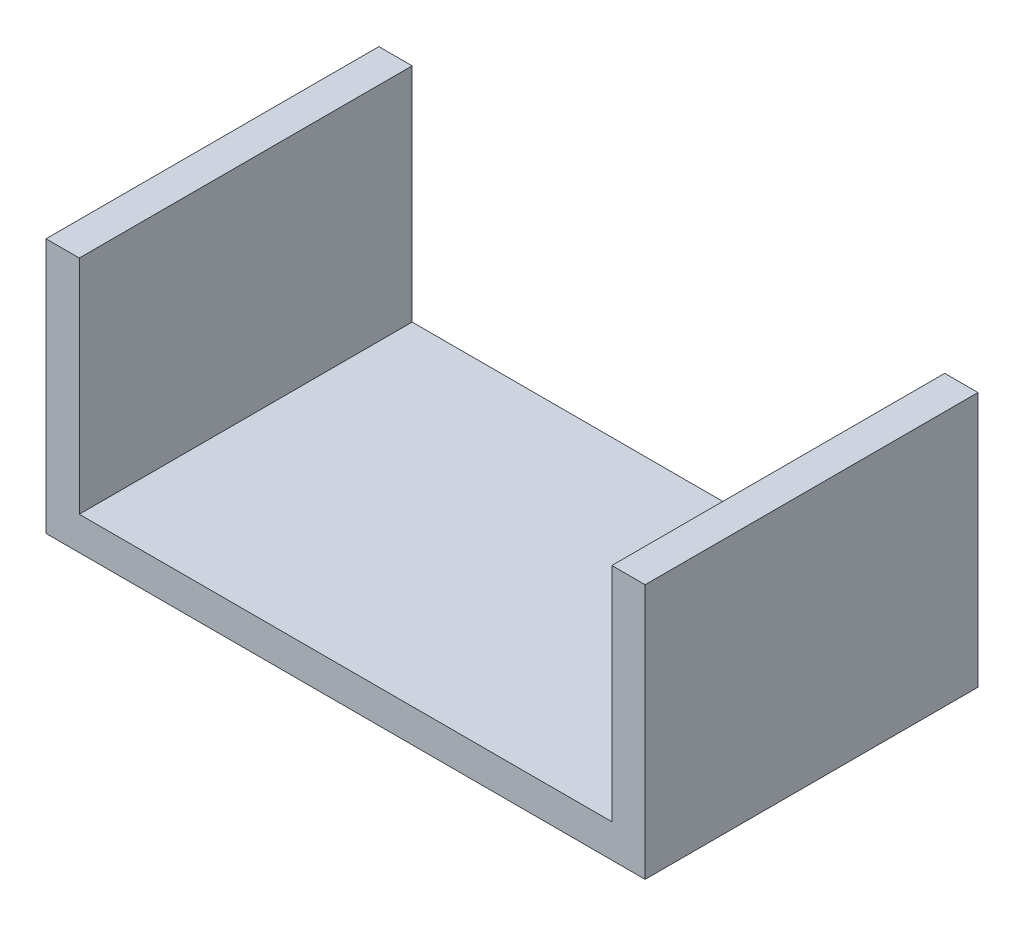
ISO-10303-21;
HEADER;
FILE_DESCRIPTION(('STEP AP214'),'2;1');
FILE_NAME('part.step','',(''),(''),'','','');
FILE_SCHEMA(('AUTOMOTIVE_DESIGN { 1 0 10303 214 1 1 1 1 }'));
ENDSEC;
DATA;
#1=APPLICATION_CONTEXT('core data for automotive mechanical design processes');
#2=APPLICATION_PROTOCOL_DEFINITION('international standard','automotive_design',2000,#1);
#3=PRODUCT_CONTEXT('',#1,'mechanical');
#4=PRODUCT('Part','Part','',(#3));
#5=PRODUCT_RELATED_PRODUCT_CATEGORY('part','',(#4));
#6=PRODUCT_DEFINITION_FORMATION('','',#4);
#7=PRODUCT_DEFINITION_CONTEXT('part definition',#1,'design');
#8=PRODUCT_DEFINITION('design','',#6,#7);
#9=PRODUCT_DEFINITION_SHAPE('','',#8);
#10=(LENGTH_UNIT() NAMED_UNIT(*) SI_UNIT(.MILLI.,.METRE.));
#11=(NAMED_UNIT(*) PLANE_ANGLE_UNIT() SI_UNIT($,.RADIAN.));
#12=(NAMED_UNIT(*) SI_UNIT($,.STERADIAN.) SOLID_ANGLE_UNIT());
#13=UNCERTAINTY_MEASURE_WITH_UNIT(LENGTH_MEASURE(1.E-05),#10,'distance_accuracy_value','');
#14=(GEOMETRIC_REPRESENTATION_CONTEXT(3) GLOBAL_UNCERTAINTY_ASSIGNED_CONTEXT((#13)) GLOBAL_UNIT_ASSIGNED_CONTEXT((#10,
#11,#12)) REPRESENTATION_CONTEXT('',''));
#15=CARTESIAN_POINT('',(0.,0.,0.));
#16=DIRECTION('',(0.,0.,1.));
#17=DIRECTION('',(1.,0.,0.));
#18=AXIS2_PLACEMENT_3D('',#15,#16,#17);
#19=CARTESIAN_POINT('',(0.,3.,0.));
#20=DIRECTION('',(0.,-1.,0.));
#21=DIRECTION('',(0.,0.,-1.));
#22=AXIS2_PLACEMENT_3D('',#19,#20,#21);
#23=PLANE('',#22);
#24=DIRECTION('',(0.,0.,1.));
#25=VECTOR('',#24,1.);
#26=CARTESIAN_POINT('',(24.,3.,15.));
#27=LINE('',#26,#25);
#28=CARTESIAN_POINT('',(24.,3.,-15.));
#29=VERTEX_POINT('',#28);
#30=CARTESIAN_POINT('',(24.,3.,15.));
#31=VERTEX_POINT('',#30);
#32=EDGE_CURVE('E128',#29,#31,#27,.T.);
#33=ORIENTED_EDGE('',*,*,#32,.F.);
#34=DIRECTION('',(-1.,0.,0.));
#35=VECTOR('',#34,1.);
#36=CARTESIAN_POINT('',(-27.,3.,-15.));
#37=LINE('',#36,#35);
#38=CARTESIAN_POINT('',(-24.,3.,-15.));
#39=VERTEX_POINT('',#38);
#40=EDGE_CURVE('E157',#29,#39,#37,.T.);
#41=ORIENTED_EDGE('',*,*,#40,.T.);
#42=DIRECTION('',(0.,0.,-1.));
#43=VECTOR('',#42,1.);
#44=CARTESIAN_POINT('',(-24.,3.,15.));
#45=LINE('',#44,#43);
#46=CARTESIAN_POINT('',(-24.,3.,15.));
#47=VERTEX_POINT('',#46);
#48=EDGE_CURVE('E59',#47,#39,#45,.T.);
#49=ORIENTED_EDGE('',*,*,#48,.F.);
#50=DIRECTION('',(1.,0.,0.));
#51=VECTOR('',#50,1.);
#52=CARTESIAN_POINT('',(-27.,3.,15.));
#53=LINE('',#52,#51);
#54=EDGE_CURVE('E54',#47,#31,#53,.T.);
#55=ORIENTED_EDGE('',*,*,#54,.T.);
#56=EDGE_LOOP('',(#33,#41,#49,#55));
#57=FACE_BOUND('',#56,.T.);
#58=ADVANCED_FACE('F39',(#57),#23,.F.);
#59=CARTESIAN_POINT('',(-27.,3.,15.));
#60=DIRECTION('',(1.,0.,0.));
#61=DIRECTION('',(0.,0.,-1.));
#62=AXIS2_PLACEMENT_3D('',#59,#60,#61);
#63=PLANE('',#62);
#64=DIRECTION('',(0.,0.,1.));
#65=VECTOR('',#64,1.);
#66=CARTESIAN_POINT('',(-27.,0.,15.));
#67=LINE('',#66,#65);
#68=CARTESIAN_POINT('',(-27.,0.,-15.));
#69=VERTEX_POINT('',#68);
#70=CARTESIAN_POINT('',(-27.,0.,15.));
#71=VERTEX_POINT('',#70);
#72=EDGE_CURVE('E155',#69,#71,#67,.T.);
#73=ORIENTED_EDGE('',*,*,#72,.T.);
#74=DIRECTION('',(0.,-1.,0.));
#75=VECTOR('',#74,1.);
#76=CARTESIAN_POINT('',(-27.,3.,15.));
#77=LINE('',#76,#75);
#78=CARTESIAN_POINT('',(-27.,23.,15.));
#79=VERTEX_POINT('',#78);
#80=EDGE_CURVE('E11',#79,#71,#77,.T.);
#81=ORIENTED_EDGE('',*,*,#80,.F.);
#82=DIRECTION('',(0.,0.,1.));
#83=VECTOR('',#82,1.);
#84=CARTESIAN_POINT('',(-27.,23.,15.));
#85=LINE('',#84,#83);
#86=CARTESIAN_POINT('',(-27.,23.,-15.));
#87=VERTEX_POINT('',#86);
#88=EDGE_CURVE('E138',#87,#79,#85,.T.);
#89=ORIENTED_EDGE('',*,*,#88,.F.);
#90=DIRECTION('',(0.,-1.,0.));
#91=VECTOR('',#90,1.);
#92=CARTESIAN_POINT('',(-27.,3.,-15.));
#93=LINE('',#92,#91);
#94=EDGE_CURVE('E113',#87,#69,#93,.T.);
#95=ORIENTED_EDGE('',*,*,#94,.T.);
#96=EDGE_LOOP('',(#73,#81,#89,#95));
#97=FACE_BOUND('',#96,.T.);
#98=ADVANCED_FACE('F41',(#97),#63,.F.);
#99=CARTESIAN_POINT('',(-27.,3.,15.));
#100=DIRECTION('',(0.,0.,-1.));
#101=DIRECTION('',(-1.,0.,0.));
#102=AXIS2_PLACEMENT_3D('',#99,#100,#101);
#103=PLANE('',#102);
#104=DIRECTION('',(1.,0.,0.));
#105=VECTOR('',#104,1.);
#106=CARTESIAN_POINT('',(-27.,0.,15.));
#107=LINE('',#106,#105);
#108=CARTESIAN_POINT('',(27.,0.,15.));
#109=VERTEX_POINT('',#108);
#110=EDGE_CURVE('E162',#71,#109,#107,.T.);
#111=ORIENTED_EDGE('',*,*,#110,.T.);
#112=DIRECTION('',(0.,-1.,0.));
#113=VECTOR('',#112,1.);
#114=CARTESIAN_POINT('',(27.,3.,15.));
#115=LINE('',#114,#113);
#116=CARTESIAN_POINT('',(27.,23.,15.));
#117=VERTEX_POINT('',#116);
#118=EDGE_CURVE('E47',#117,#109,#115,.T.);
#119=ORIENTED_EDGE('',*,*,#118,.F.);
#120=DIRECTION('',(1.,0.,0.));
#121=VECTOR('',#120,1.);
#122=CARTESIAN_POINT('',(27.,23.,15.));
#123=LINE('',#122,#121);
#124=CARTESIAN_POINT('',(24.,23.,15.));
#125=VERTEX_POINT('',#124);
#126=EDGE_CURVE('E127',#125,#117,#123,.T.);
#127=ORIENTED_EDGE('',*,*,#126,.F.);
#128=DIRECTION('',(0.,-1.,0.));
#129=VECTOR('',#128,1.);
#130=CARTESIAN_POINT('',(24.,23.,15.));
#131=LINE('',#130,#129);
#132=EDGE_CURVE('E133',#125,#31,#131,.T.);
#133=ORIENTED_EDGE('',*,*,#132,.T.);
#134=ORIENTED_EDGE('',*,*,#54,.F.);
#135=DIRECTION('',(0.,-1.,0.));
#136=VECTOR('',#135,1.);
#137=CARTESIAN_POINT('',(-24.,23.,15.));
#138=LINE('',#137,#136);
#139=CARTESIAN_POINT('',(-24.,23.,15.));
#140=VERTEX_POINT('',#139);
#141=EDGE_CURVE('E152',#140,#47,#138,.T.);
#142=ORIENTED_EDGE('',*,*,#141,.F.);
#143=DIRECTION('',(1.,0.,0.));
#144=VECTOR('',#143,1.);
#145=CARTESIAN_POINT('',(-27.,23.,15.));
#146=LINE('',#145,#144);
#147=EDGE_CURVE('E141',#79,#140,#146,.T.);
#148=ORIENTED_EDGE('',*,*,#147,.F.);
#149=ORIENTED_EDGE('',*,*,#80,.T.);
#150=EDGE_LOOP('',(#111,#119,#127,#133,#134,#142,#148,#149));
#151=FACE_BOUND('',#150,.T.);
#152=ADVANCED_FACE('F182',(#151),#103,.F.);
#153=CARTESIAN_POINT('',(27.,3.,15.));
#154=DIRECTION('',(-1.,0.,0.));
#155=DIRECTION('',(0.,0.,1.));
#156=AXIS2_PLACEMENT_3D('',#153,#154,#155);
#157=PLANE('',#156);
#158=DIRECTION('',(0.,0.,-1.));
#159=VECTOR('',#158,1.);
#160=CARTESIAN_POINT('',(27.,0.,15.));
#161=LINE('',#160,#159);
#162=CARTESIAN_POINT('',(27.,0.,-15.));
#163=VERTEX_POINT('',#162);
#164=EDGE_CURVE('E110',#109,#163,#161,.T.);
#165=ORIENTED_EDGE('',*,*,#164,.T.);
#166=DIRECTION('',(0.,-1.,0.));
#167=VECTOR('',#166,1.);
#168=CARTESIAN_POINT('',(27.,3.,-15.));
#169=LINE('',#168,#167);
#170=CARTESIAN_POINT('',(27.,23.,-15.));
#171=VERTEX_POINT('',#170);
#172=EDGE_CURVE('E103',#171,#163,#169,.T.);
#173=ORIENTED_EDGE('',*,*,#172,.F.);
#174=DIRECTION('',(0.,0.,-1.));
#175=VECTOR('',#174,1.);
#176=CARTESIAN_POINT('',(27.,23.,15.));
#177=LINE('',#176,#175);
#178=EDGE_CURVE('E108',#117,#171,#177,.T.);
#179=ORIENTED_EDGE('',*,*,#178,.F.);
#180=ORIENTED_EDGE('',*,*,#118,.T.);
#181=EDGE_LOOP('',(#165,#173,#179,#180));
#182=FACE_BOUND('',#181,.T.);
#183=ADVANCED_FACE('F105',(#182),#157,.F.);
#184=CARTESIAN_POINT('',(-27.,3.,-15.));
#185=DIRECTION('',(0.,0.,1.));
#186=DIRECTION('',(1.,0.,0.));
#187=AXIS2_PLACEMENT_3D('',#184,#185,#186);
#188=PLANE('',#187);
#189=DIRECTION('',(-1.,0.,0.));
#190=VECTOR('',#189,1.);
#191=CARTESIAN_POINT('',(-27.,0.,-15.));
#192=LINE('',#191,#190);
#193=EDGE_CURVE('E158',#163,#69,#192,.T.);
#194=ORIENTED_EDGE('',*,*,#193,.T.);
#195=ORIENTED_EDGE('',*,*,#94,.F.);
#196=DIRECTION('',(-1.,0.,0.));
#197=VECTOR('',#196,1.);
#198=CARTESIAN_POINT('',(-27.,23.,-15.));
#199=LINE('',#198,#197);
#200=CARTESIAN_POINT('',(-24.,23.,-15.));
#201=VERTEX_POINT('',#200);
#202=EDGE_CURVE('E145',#201,#87,#199,.T.);
#203=ORIENTED_EDGE('',*,*,#202,.F.);
#204=DIRECTION('',(0.,-1.,0.));
#205=VECTOR('',#204,1.);
#206=CARTESIAN_POINT('',(-24.,23.,-15.));
#207=LINE('',#206,#205);
#208=EDGE_CURVE('E148',#201,#39,#207,.T.);
#209=ORIENTED_EDGE('',*,*,#208,.T.);
#210=ORIENTED_EDGE('',*,*,#40,.F.);
#211=DIRECTION('',(0.,-1.,0.));
#212=VECTOR('',#211,1.);
#213=CARTESIAN_POINT('',(24.,23.,-15.));
#214=LINE('',#213,#212);
#215=CARTESIAN_POINT('',(24.,23.,-15.));
#216=VERTEX_POINT('',#215);
#217=EDGE_CURVE('E119',#216,#29,#214,.T.);
#218=ORIENTED_EDGE('',*,*,#217,.F.);
#219=DIRECTION('',(-1.,0.,0.));
#220=VECTOR('',#219,1.);
#221=CARTESIAN_POINT('',(27.,23.,-15.));
#222=LINE('',#221,#220);
#223=EDGE_CURVE('E116',#171,#216,#222,.T.);
#224=ORIENTED_EDGE('',*,*,#223,.F.);
#225=ORIENTED_EDGE('',*,*,#172,.T.);
#226=EDGE_LOOP('',(#194,#195,#203,#209,#210,#218,#224,#225));
#227=FACE_BOUND('',#226,.T.);
#228=ADVANCED_FACE('F117',(#227),#188,.F.);
#229=CARTESIAN_POINT('',(0.,0.,0.));
#230=DIRECTION('',(0.,-1.,0.));
#231=DIRECTION('',(0.,0.,-1.));
#232=AXIS2_PLACEMENT_3D('',#229,#230,#231);
#233=PLANE('',#232);
#234=ORIENTED_EDGE('',*,*,#72,.F.);
#235=ORIENTED_EDGE('',*,*,#193,.F.);
#236=ORIENTED_EDGE('',*,*,#164,.F.);
#237=ORIENTED_EDGE('',*,*,#110,.F.);
#238=EDGE_LOOP('',(#234,#235,#236,#237));
#239=FACE_BOUND('',#238,.T.);
#240=ADVANCED_FACE('F170',(#239),#233,.T.);
#241=CARTESIAN_POINT('',(-24.,23.,15.));
#242=DIRECTION('',(-1.,0.,0.));
#243=DIRECTION('',(0.,0.,1.));
#244=AXIS2_PLACEMENT_3D('',#241,#242,#243);
#245=PLANE('',#244);
#246=ORIENTED_EDGE('',*,*,#48,.T.);
#247=ORIENTED_EDGE('',*,*,#208,.F.);
#248=DIRECTION('',(0.,0.,-1.));
#249=VECTOR('',#248,1.);
#250=CARTESIAN_POINT('',(-24.,23.,15.));
#251=LINE('',#250,#249);
#252=EDGE_CURVE('E143',#140,#201,#251,.T.);
#253=ORIENTED_EDGE('',*,*,#252,.F.);
#254=ORIENTED_EDGE('',*,*,#141,.T.);
#255=EDGE_LOOP('',(#246,#247,#253,#254));
#256=FACE_BOUND('',#255,.T.);
#257=ADVANCED_FACE('F181',(#256),#245,.F.);
#258=CARTESIAN_POINT('',(0.,23.,0.));
#259=DIRECTION('',(0.,-1.,0.));
#260=DIRECTION('',(0.,0.,-1.));
#261=AXIS2_PLACEMENT_3D('',#258,#259,#260);
#262=PLANE('',#261);
#263=ORIENTED_EDGE('',*,*,#88,.T.);
#264=ORIENTED_EDGE('',*,*,#147,.T.);
#265=ORIENTED_EDGE('',*,*,#252,.T.);
#266=ORIENTED_EDGE('',*,*,#202,.T.);
#267=EDGE_LOOP('',(#263,#264,#265,#266));
#268=FACE_BOUND('',#267,.T.);
#269=ADVANCED_FACE('F176',(#268),#262,.F.);
#270=CARTESIAN_POINT('',(24.,23.,15.));
#271=DIRECTION('',(1.,0.,0.));
#272=DIRECTION('',(0.,0.,-1.));
#273=AXIS2_PLACEMENT_3D('',#270,#271,#272);
#274=PLANE('',#273);
#275=ORIENTED_EDGE('',*,*,#32,.T.);
#276=ORIENTED_EDGE('',*,*,#132,.F.);
#277=DIRECTION('',(0.,0.,1.));
#278=VECTOR('',#277,1.);
#279=CARTESIAN_POINT('',(24.,23.,15.));
#280=LINE('',#279,#278);
#281=EDGE_CURVE('E122',#216,#125,#280,.T.);
#282=ORIENTED_EDGE('',*,*,#281,.F.);
#283=ORIENTED_EDGE('',*,*,#217,.T.);
#284=EDGE_LOOP('',(#275,#276,#282,#283));
#285=FACE_BOUND('',#284,.T.);
#286=ADVANCED_FACE('F185',(#285),#274,.F.);
#287=CARTESIAN_POINT('',(0.,23.,0.));
#288=DIRECTION('',(0.,1.,0.));
#289=DIRECTION('',(0.,0.,1.));
#290=AXIS2_PLACEMENT_3D('',#287,#288,#289);
#291=PLANE('',#290);
#292=ORIENTED_EDGE('',*,*,#178,.T.);
#293=ORIENTED_EDGE('',*,*,#223,.T.);
#294=ORIENTED_EDGE('',*,*,#281,.T.);
#295=ORIENTED_EDGE('',*,*,#126,.T.);
#296=EDGE_LOOP('',(#292,#293,#294,#295));
#297=FACE_BOUND('',#296,.T.);
#298=ADVANCED_FACE('F125',(#297),#291,.T.);
#299=CLOSED_SHELL('',(#58,#98,#152,#183,#228,#240,#257,#269,#286,#298));
#300=MANIFOLD_SOLID_BREP('B2',#299);
#301=ADVANCED_BREP_SHAPE_REPRESENTATION('',(#18,#300),#14);
#302=SHAPE_DEFINITION_REPRESENTATION(#9,#301);
ENDSEC;
END-ISO-10303-21;
